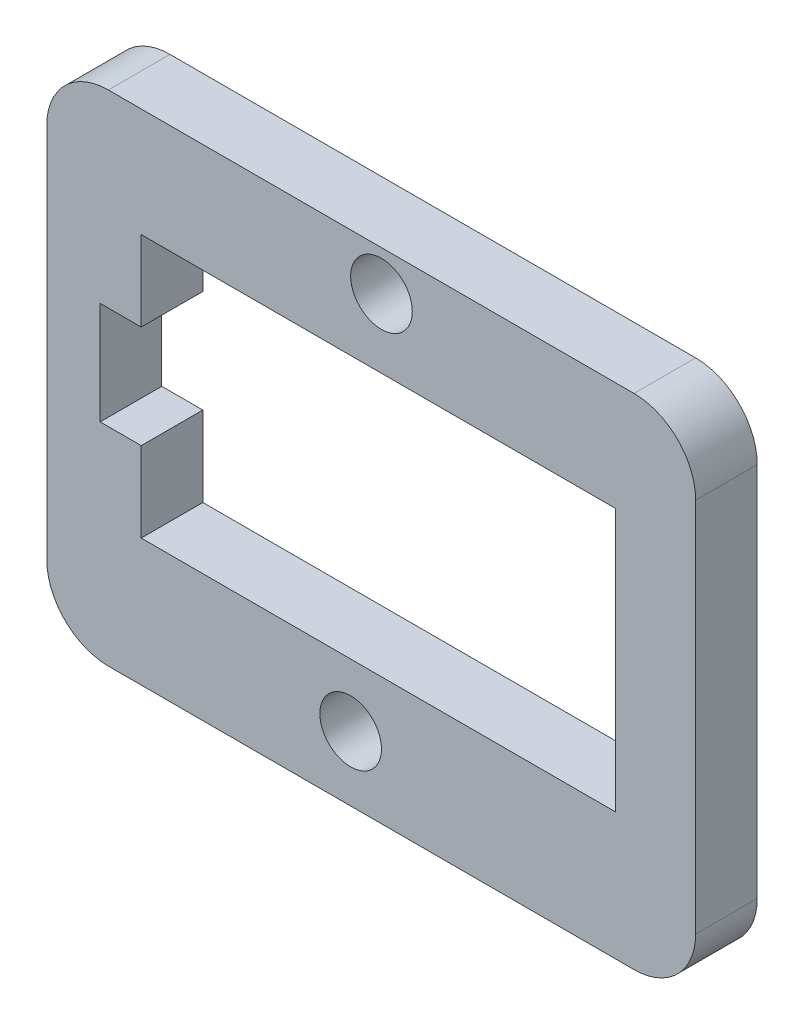
ISO-10303-21;
HEADER;
FILE_DESCRIPTION(('STEP AP214'),'2;1');
FILE_NAME('part.step','',(''),(''),'','','');
FILE_SCHEMA(('AUTOMOTIVE_DESIGN { 1 0 10303 214 1 1 1 1 }'));
ENDSEC;
DATA;
#1=APPLICATION_CONTEXT('core data for automotive mechanical design processes');
#2=APPLICATION_PROTOCOL_DEFINITION('international standard','automotive_design',2000,#1);
#3=PRODUCT_CONTEXT('',#1,'mechanical');
#4=PRODUCT('Part','Part','',(#3));
#5=PRODUCT_RELATED_PRODUCT_CATEGORY('part','',(#4));
#6=PRODUCT_DEFINITION_FORMATION('','',#4);
#7=PRODUCT_DEFINITION_CONTEXT('part definition',#1,'design');
#8=PRODUCT_DEFINITION('design','',#6,#7);
#9=PRODUCT_DEFINITION_SHAPE('','',#8);
#10=(LENGTH_UNIT() NAMED_UNIT(*) SI_UNIT(.MILLI.,.METRE.));
#11=(NAMED_UNIT(*) PLANE_ANGLE_UNIT() SI_UNIT($,.RADIAN.));
#12=(NAMED_UNIT(*) SI_UNIT($,.STERADIAN.) SOLID_ANGLE_UNIT());
#13=UNCERTAINTY_MEASURE_WITH_UNIT(LENGTH_MEASURE(1.E-05),#10,'distance_accuracy_value','');
#14=(GEOMETRIC_REPRESENTATION_CONTEXT(3) GLOBAL_UNCERTAINTY_ASSIGNED_CONTEXT((#13)) GLOBAL_UNIT_ASSIGNED_CONTEXT((#10,
#11,#12)) REPRESENTATION_CONTEXT('',''));
#15=CARTESIAN_POINT('',(0.,0.,0.));
#16=DIRECTION('',(0.,0.,1.));
#17=DIRECTION('',(1.,0.,0.));
#18=AXIS2_PLACEMENT_3D('',#15,#16,#17);
#19=CARTESIAN_POINT('',(25.6000000000002,0.,3.));
#20=DIRECTION('',(0.,0.,1.));
#21=DIRECTION('',(1.,0.,0.));
#22=AXIS2_PLACEMENT_3D('',#19,#20,#21);
#23=PLANE('',#22);
#24=CARTESIAN_POINT('',(11.8,0.150000000000095,3.));
#25=DIRECTION('',(0.,0.,1.));
#26=DIRECTION('',(1.,0.,0.));
#27=AXIS2_PLACEMENT_3D('',#24,#25,#26);
#28=CIRCLE('',#27,1.49999999999995);
#29=CARTESIAN_POINT('',(13.2999999999999,0.150000000000095,3.));
#30=VERTEX_POINT('',#29);
#31=EDGE_CURVE('E185',#30,#30,#28,.T.);
#32=ORIENTED_EDGE('',*,*,#31,.F.);
#33=EDGE_LOOP('',(#32));
#34=FACE_BOUND('',#33,.T.);
#35=CARTESIAN_POINT('',(25.6000000000002,0.,3.));
#36=DIRECTION('',(0.,0.,1.));
#37=DIRECTION('',(1.,0.,0.));
#38=AXIS2_PLACEMENT_3D('',#35,#36,#37);
#39=CIRCLE('',#38,2.99999999999989);
#40=CARTESIAN_POINT('',(25.6,-2.99999999999989,3.));
#41=VERTEX_POINT('',#40);
#42=CARTESIAN_POINT('',(28.6000000000001,8.13585310233123E-13,3.));
#43=VERTEX_POINT('',#42);
#44=EDGE_CURVE('E215',#41,#43,#39,.T.);
#45=ORIENTED_EDGE('',*,*,#44,.T.);
#46=DIRECTION('',(0.,1.,0.));
#47=VECTOR('',#46,1.);
#48=CARTESIAN_POINT('',(28.6000000000001,8.13585310233123E-13,3.));
#49=LINE('',#48,#47);
#50=CARTESIAN_POINT('',(28.6000000000001,18.3000000000006,3.));
#51=VERTEX_POINT('',#50);
#52=EDGE_CURVE('E218',#43,#51,#49,.T.);
#53=ORIENTED_EDGE('',*,*,#52,.T.);
#54=CARTESIAN_POINT('',(25.6000000000002,18.3000000000002,3.));
#55=DIRECTION('',(0.,0.,1.));
#56=DIRECTION('',(1.,0.,0.));
#57=AXIS2_PLACEMENT_3D('',#54,#55,#56);
#58=CIRCLE('',#57,2.99999999999989);
#59=CARTESIAN_POINT('',(25.6,21.3000000000001,3.));
#60=VERTEX_POINT('',#59);
#61=EDGE_CURVE('E221',#51,#60,#58,.T.);
#62=ORIENTED_EDGE('',*,*,#61,.T.);
#63=DIRECTION('',(-1.,0.,0.));
#64=VECTOR('',#63,1.);
#65=CARTESIAN_POINT('',(25.6,21.3000000000001,3.));
#66=LINE('',#65,#64);
#67=CARTESIAN_POINT('',(0.,21.3000000000001,3.));
#68=VERTEX_POINT('',#67);
#69=EDGE_CURVE('E223',#60,#68,#66,.T.);
#70=ORIENTED_EDGE('',*,*,#69,.T.);
#71=CARTESIAN_POINT('',(0.,18.3000000000002,3.));
#72=DIRECTION('',(0.,0.,1.));
#73=DIRECTION('',(1.,0.,0.));
#74=AXIS2_PLACEMENT_3D('',#71,#72,#73);
#75=CIRCLE('',#74,2.99999999999989);
#76=CARTESIAN_POINT('',(-2.99999999999989,18.2999999999959,3.));
#77=VERTEX_POINT('',#76);
#78=EDGE_CURVE('E225',#68,#77,#75,.T.);
#79=ORIENTED_EDGE('',*,*,#78,.T.);
#80=DIRECTION('',(0.,-1.,0.));
#81=VECTOR('',#80,1.);
#82=CARTESIAN_POINT('',(-2.99999999999989,18.2999999999959,3.));
#83=LINE('',#82,#81);
#84=CARTESIAN_POINT('',(-2.99999999999989,-3.87519914032161E-12,3.));
#85=VERTEX_POINT('',#84);
#86=EDGE_CURVE('E227',#77,#85,#83,.T.);
#87=ORIENTED_EDGE('',*,*,#86,.T.);
#88=CARTESIAN_POINT('',(0.,0.,3.));
#89=DIRECTION('',(0.,0.,1.));
#90=DIRECTION('',(1.,0.,0.));
#91=AXIS2_PLACEMENT_3D('',#88,#89,#90);
#92=CIRCLE('',#91,2.99999999999989);
#93=CARTESIAN_POINT('',(0.,-2.99999999999989,3.));
#94=VERTEX_POINT('',#93);
#95=EDGE_CURVE('E229',#85,#94,#92,.T.);
#96=ORIENTED_EDGE('',*,*,#95,.T.);
#97=DIRECTION('',(1.,0.,0.));
#98=VECTOR('',#97,1.);
#99=CARTESIAN_POINT('',(0.,-2.99999999999989,3.));
#100=LINE('',#99,#98);
#101=EDGE_CURVE('E231',#94,#41,#100,.T.);
#102=ORIENTED_EDGE('',*,*,#101,.T.);
#103=EDGE_LOOP('',(#45,#53,#62,#70,#79,#87,#96,#102));
#104=FACE_BOUND('',#103,.T.);
#105=DIRECTION('',(0.,1.,0.));
#106=VECTOR('',#105,1.);
#107=CARTESIAN_POINT('',(24.6999999999972,3.20000000000009,3.));
#108=LINE('',#107,#106);
#109=CARTESIAN_POINT('',(24.6999999999972,3.20000000000009,3.));
#110=VERTEX_POINT('',#109);
#111=CARTESIAN_POINT('',(24.6999999999972,16.,3.));
#112=VERTEX_POINT('',#111);
#113=EDGE_CURVE('E155',#110,#112,#108,.T.);
#114=ORIENTED_EDGE('',*,*,#113,.F.);
#115=DIRECTION('',(1.,0.,0.));
#116=VECTOR('',#115,1.);
#117=CARTESIAN_POINT('',(1.60000000000008,3.20000000000009,3.));
#118=LINE('',#117,#116);
#119=CARTESIAN_POINT('',(1.60000000000008,3.20000000000009,3.));
#120=VERTEX_POINT('',#119);
#121=EDGE_CURVE('E147',#120,#110,#118,.T.);
#122=ORIENTED_EDGE('',*,*,#121,.F.);
#123=DIRECTION('',(0.,-1.,0.));
#124=VECTOR('',#123,1.);
#125=CARTESIAN_POINT('',(1.60000000000008,7.10000000000011,3.));
#126=LINE('',#125,#124);
#127=CARTESIAN_POINT('',(1.60000000000008,7.10000000000011,3.));
#128=VERTEX_POINT('',#127);
#129=EDGE_CURVE('E182',#128,#120,#126,.T.);
#130=ORIENTED_EDGE('',*,*,#129,.F.);
#131=DIRECTION('',(1.,0.,0.));
#132=VECTOR('',#131,1.);
#133=CARTESIAN_POINT('',(-0.399999999999925,7.10000000000011,3.));
#134=LINE('',#133,#132);
#135=CARTESIAN_POINT('',(-0.399999999999925,7.10000000000011,3.));
#136=VERTEX_POINT('',#135);
#137=EDGE_CURVE('E180',#136,#128,#134,.T.);
#138=ORIENTED_EDGE('',*,*,#137,.F.);
#139=DIRECTION('',(0.,-1.,0.));
#140=VECTOR('',#139,1.);
#141=CARTESIAN_POINT('',(-0.399999999999925,12.1,3.));
#142=LINE('',#141,#140);
#143=CARTESIAN_POINT('',(-0.399999999999925,12.1,3.));
#144=VERTEX_POINT('',#143);
#145=EDGE_CURVE('E178',#144,#136,#142,.T.);
#146=ORIENTED_EDGE('',*,*,#145,.F.);
#147=DIRECTION('',(-1.,0.,0.));
#148=VECTOR('',#147,1.);
#149=CARTESIAN_POINT('',(1.5999999999973,12.1,3.));
#150=LINE('',#149,#148);
#151=CARTESIAN_POINT('',(1.5999999999973,12.1,3.));
#152=VERTEX_POINT('',#151);
#153=EDGE_CURVE('E176',#152,#144,#150,.T.);
#154=ORIENTED_EDGE('',*,*,#153,.F.);
#155=DIRECTION('',(0.,-1.,0.));
#156=VECTOR('',#155,1.);
#157=CARTESIAN_POINT('',(1.5999999999973,16.,3.));
#158=LINE('',#157,#156);
#159=CARTESIAN_POINT('',(1.5999999999973,16.,3.));
#160=VERTEX_POINT('',#159);
#161=EDGE_CURVE('E171',#160,#152,#158,.T.);
#162=ORIENTED_EDGE('',*,*,#161,.F.);
#163=DIRECTION('',(-1.,0.,0.));
#164=VECTOR('',#163,1.);
#165=CARTESIAN_POINT('',(24.6999999999972,16.,3.));
#166=LINE('',#165,#164);
#167=EDGE_CURVE('E169',#112,#160,#166,.T.);
#168=ORIENTED_EDGE('',*,*,#167,.F.);
#169=EDGE_LOOP('',(#114,#122,#130,#138,#146,#154,#162,#168));
#170=FACE_BOUND('',#169,.T.);
#171=CARTESIAN_POINT('',(13.300000000001,19.35,3.));
#172=DIRECTION('',(0.,0.,1.));
#173=DIRECTION('',(1.,0.,0.));
#174=AXIS2_PLACEMENT_3D('',#171,#172,#173);
#175=CIRCLE('',#174,1.49999999999995);
#176=CARTESIAN_POINT('',(14.8000000000009,19.35,3.));
#177=VERTEX_POINT('',#176);
#178=EDGE_CURVE('E371',#177,#177,#175,.T.);
#179=ORIENTED_EDGE('',*,*,#178,.F.);
#180=EDGE_LOOP('',(#179));
#181=FACE_BOUND('',#180,.T.);
#182=ADVANCED_FACE('F34',(#34,#104,#170,#181),#23,.T.);
#183=CARTESIAN_POINT('',(25.6000000000002,0.,0.));
#184=DIRECTION('',(0.,0.,1.));
#185=DIRECTION('',(1.,0.,0.));
#186=AXIS2_PLACEMENT_3D('',#183,#184,#185);
#187=PLANE('',#186);
#188=CARTESIAN_POINT('',(25.6000000000002,0.,0.));
#189=DIRECTION('',(0.,0.,1.));
#190=DIRECTION('',(1.,0.,0.));
#191=AXIS2_PLACEMENT_3D('',#188,#189,#190);
#192=CIRCLE('',#191,2.99999999999989);
#193=CARTESIAN_POINT('',(25.6,-2.99999999999989,0.));
#194=VERTEX_POINT('',#193);
#195=CARTESIAN_POINT('',(28.6000000000001,8.13585310233123E-13,0.));
#196=VERTEX_POINT('',#195);
#197=EDGE_CURVE('E163',#194,#196,#192,.T.);
#198=ORIENTED_EDGE('',*,*,#197,.F.);
#199=DIRECTION('',(1.,0.,0.));
#200=VECTOR('',#199,1.);
#201=CARTESIAN_POINT('',(0.,-2.99999999999989,0.));
#202=LINE('',#201,#200);
#203=CARTESIAN_POINT('',(0.,-2.99999999999989,0.));
#204=VERTEX_POINT('',#203);
#205=EDGE_CURVE('E219',#204,#194,#202,.T.);
#206=ORIENTED_EDGE('',*,*,#205,.F.);
#207=CARTESIAN_POINT('',(0.,0.,0.));
#208=DIRECTION('',(0.,0.,1.));
#209=DIRECTION('',(1.,0.,0.));
#210=AXIS2_PLACEMENT_3D('',#207,#208,#209);
#211=CIRCLE('',#210,2.99999999999989);
#212=CARTESIAN_POINT('',(-2.99999999999989,-3.87519914032161E-12,0.));
#213=VERTEX_POINT('',#212);
#214=EDGE_CURVE('E246',#213,#204,#211,.T.);
#215=ORIENTED_EDGE('',*,*,#214,.F.);
#216=DIRECTION('',(0.,-1.,0.));
#217=VECTOR('',#216,1.);
#218=CARTESIAN_POINT('',(-2.99999999999989,18.2999999999959,0.));
#219=LINE('',#218,#217);
#220=CARTESIAN_POINT('',(-2.99999999999989,18.2999999999959,0.));
#221=VERTEX_POINT('',#220);
#222=EDGE_CURVE('E244',#221,#213,#219,.T.);
#223=ORIENTED_EDGE('',*,*,#222,.F.);
#224=CARTESIAN_POINT('',(0.,18.3000000000002,0.));
#225=DIRECTION('',(0.,0.,1.));
#226=DIRECTION('',(1.,0.,0.));
#227=AXIS2_PLACEMENT_3D('',#224,#225,#226);
#228=CIRCLE('',#227,2.99999999999989);
#229=CARTESIAN_POINT('',(0.,21.3000000000001,0.));
#230=VERTEX_POINT('',#229);
#231=EDGE_CURVE('E242',#230,#221,#228,.T.);
#232=ORIENTED_EDGE('',*,*,#231,.F.);
#233=DIRECTION('',(-1.,0.,0.));
#234=VECTOR('',#233,1.);
#235=CARTESIAN_POINT('',(25.6,21.3000000000001,0.));
#236=LINE('',#235,#234);
#237=CARTESIAN_POINT('',(25.6,21.3000000000001,0.));
#238=VERTEX_POINT('',#237);
#239=EDGE_CURVE('E240',#238,#230,#236,.T.);
#240=ORIENTED_EDGE('',*,*,#239,.F.);
#241=CARTESIAN_POINT('',(25.6000000000002,18.3000000000002,0.));
#242=DIRECTION('',(0.,0.,1.));
#243=DIRECTION('',(1.,0.,0.));
#244=AXIS2_PLACEMENT_3D('',#241,#242,#243);
#245=CIRCLE('',#244,2.99999999999989);
#246=CARTESIAN_POINT('',(28.6000000000001,18.3000000000006,0.));
#247=VERTEX_POINT('',#246);
#248=EDGE_CURVE('E238',#247,#238,#245,.T.);
#249=ORIENTED_EDGE('',*,*,#248,.F.);
#250=DIRECTION('',(0.,1.,0.));
#251=VECTOR('',#250,1.);
#252=CARTESIAN_POINT('',(28.6000000000001,8.13585310233123E-13,0.));
#253=LINE('',#252,#251);
#254=EDGE_CURVE('E236',#196,#247,#253,.T.);
#255=ORIENTED_EDGE('',*,*,#254,.F.);
#256=EDGE_LOOP('',(#198,#206,#215,#223,#232,#240,#249,#255));
#257=FACE_BOUND('',#256,.T.);
#258=DIRECTION('',(1.,0.,0.));
#259=VECTOR('',#258,1.);
#260=CARTESIAN_POINT('',(1.60000000000008,3.20000000000009,0.));
#261=LINE('',#260,#259);
#262=CARTESIAN_POINT('',(1.60000000000008,3.20000000000009,0.));
#263=VERTEX_POINT('',#262);
#264=CARTESIAN_POINT('',(24.6999999999972,3.20000000000009,0.));
#265=VERTEX_POINT('',#264);
#266=EDGE_CURVE('E57',#263,#265,#261,.T.);
#267=ORIENTED_EDGE('',*,*,#266,.T.);
#268=DIRECTION('',(0.,1.,0.));
#269=VECTOR('',#268,1.);
#270=CARTESIAN_POINT('',(24.6999999999972,3.20000000000009,0.));
#271=LINE('',#270,#269);
#272=CARTESIAN_POINT('',(24.6999999999972,16.,0.));
#273=VERTEX_POINT('',#272);
#274=EDGE_CURVE('E162',#265,#273,#271,.T.);
#275=ORIENTED_EDGE('',*,*,#274,.T.);
#276=DIRECTION('',(-1.,0.,0.));
#277=VECTOR('',#276,1.);
#278=CARTESIAN_POINT('',(24.6999999999972,16.,0.));
#279=LINE('',#278,#277);
#280=CARTESIAN_POINT('',(1.5999999999973,16.,0.));
#281=VERTEX_POINT('',#280);
#282=EDGE_CURVE('E187',#273,#281,#279,.T.);
#283=ORIENTED_EDGE('',*,*,#282,.T.);
#284=DIRECTION('',(0.,-1.,0.));
#285=VECTOR('',#284,1.);
#286=CARTESIAN_POINT('',(1.5999999999973,16.,0.));
#287=LINE('',#286,#285);
#288=CARTESIAN_POINT('',(1.5999999999973,12.1,0.));
#289=VERTEX_POINT('',#288);
#290=EDGE_CURVE('E190',#281,#289,#287,.T.);
#291=ORIENTED_EDGE('',*,*,#290,.T.);
#292=DIRECTION('',(-1.,0.,0.));
#293=VECTOR('',#292,1.);
#294=CARTESIAN_POINT('',(1.5999999999973,12.1,0.));
#295=LINE('',#294,#293);
#296=CARTESIAN_POINT('',(-0.399999999999925,12.1,0.));
#297=VERTEX_POINT('',#296);
#298=EDGE_CURVE('E193',#289,#297,#295,.T.);
#299=ORIENTED_EDGE('',*,*,#298,.T.);
#300=DIRECTION('',(0.,-1.,0.));
#301=VECTOR('',#300,1.);
#302=CARTESIAN_POINT('',(-0.399999999999925,12.1,0.));
#303=LINE('',#302,#301);
#304=CARTESIAN_POINT('',(-0.399999999999925,7.10000000000011,0.));
#305=VERTEX_POINT('',#304);
#306=EDGE_CURVE('E196',#297,#305,#303,.T.);
#307=ORIENTED_EDGE('',*,*,#306,.T.);
#308=DIRECTION('',(1.,0.,0.));
#309=VECTOR('',#308,1.);
#310=CARTESIAN_POINT('',(-0.399999999999925,7.10000000000011,0.));
#311=LINE('',#310,#309);
#312=CARTESIAN_POINT('',(1.60000000000008,7.10000000000011,0.));
#313=VERTEX_POINT('',#312);
#314=EDGE_CURVE('E199',#305,#313,#311,.T.);
#315=ORIENTED_EDGE('',*,*,#314,.T.);
#316=DIRECTION('',(0.,-1.,0.));
#317=VECTOR('',#316,1.);
#318=CARTESIAN_POINT('',(1.60000000000008,7.10000000000011,0.));
#319=LINE('',#318,#317);
#320=EDGE_CURVE('E156',#313,#263,#319,.T.);
#321=ORIENTED_EDGE('',*,*,#320,.T.);
#322=EDGE_LOOP('',(#267,#275,#283,#291,#299,#307,#315,#321));
#323=FACE_BOUND('',#322,.T.);
#324=CARTESIAN_POINT('',(11.8,0.150000000000095,0.));
#325=DIRECTION('',(0.,0.,1.));
#326=DIRECTION('',(1.,0.,0.));
#327=AXIS2_PLACEMENT_3D('',#324,#325,#326);
#328=CIRCLE('',#327,1.49999999999995);
#329=CARTESIAN_POINT('',(13.2999999999999,0.150000000000095,0.));
#330=VERTEX_POINT('',#329);
#331=EDGE_CURVE('E377',#330,#330,#328,.T.);
#332=ORIENTED_EDGE('',*,*,#331,.T.);
#333=EDGE_LOOP('',(#332));
#334=FACE_BOUND('',#333,.T.);
#335=CARTESIAN_POINT('',(13.300000000001,19.35,0.));
#336=DIRECTION('',(0.,0.,1.));
#337=DIRECTION('',(1.,0.,0.));
#338=AXIS2_PLACEMENT_3D('',#335,#336,#337);
#339=CIRCLE('',#338,1.49999999999995);
#340=CARTESIAN_POINT('',(14.8000000000009,19.35,0.));
#341=VERTEX_POINT('',#340);
#342=EDGE_CURVE('E374',#341,#341,#339,.T.);
#343=ORIENTED_EDGE('',*,*,#342,.T.);
#344=EDGE_LOOP('',(#343));
#345=FACE_BOUND('',#344,.T.);
#346=ADVANCED_FACE('F276',(#257,#323,#334,#345),#187,.F.);
#347=CARTESIAN_POINT('',(25.6000000000002,0.,3.));
#348=DIRECTION('',(0.,0.,-1.));
#349=DIRECTION('',(-1.,0.,0.));
#350=AXIS2_PLACEMENT_3D('',#347,#348,#349);
#351=CYLINDRICAL_SURFACE('',#350,2.99999999999989);
#352=ORIENTED_EDGE('',*,*,#197,.T.);
#353=DIRECTION('',(0.,0.,-1.));
#354=VECTOR('',#353,1.);
#355=CARTESIAN_POINT('',(28.6000000000001,8.13585310233123E-13,3.));
#356=LINE('',#355,#354);
#357=EDGE_CURVE('E11',#43,#196,#356,.T.);
#358=ORIENTED_EDGE('',*,*,#357,.F.);
#359=ORIENTED_EDGE('',*,*,#44,.F.);
#360=DIRECTION('',(0.,0.,-1.));
#361=VECTOR('',#360,1.);
#362=CARTESIAN_POINT('',(25.6,-2.99999999999989,3.));
#363=LINE('',#362,#361);
#364=EDGE_CURVE('E233',#41,#194,#363,.T.);
#365=ORIENTED_EDGE('',*,*,#364,.T.);
#366=EDGE_LOOP('',(#352,#358,#359,#365));
#367=FACE_BOUND('',#366,.T.);
#368=ADVANCED_FACE('F36',(#367),#351,.T.);
#369=CARTESIAN_POINT('',(28.6000000000001,8.13585310233123E-13,3.));
#370=DIRECTION('',(-1.,0.,0.));
#371=DIRECTION('',(0.,-1.,0.));
#372=AXIS2_PLACEMENT_3D('',#369,#370,#371);
#373=PLANE('',#372);
#374=ORIENTED_EDGE('',*,*,#254,.T.);
#375=DIRECTION('',(0.,0.,-1.));
#376=VECTOR('',#375,1.);
#377=CARTESIAN_POINT('',(28.6000000000001,18.3000000000006,3.));
#378=LINE('',#377,#376);
#379=EDGE_CURVE('E42',#51,#247,#378,.T.);
#380=ORIENTED_EDGE('',*,*,#379,.F.);
#381=ORIENTED_EDGE('',*,*,#52,.F.);
#382=ORIENTED_EDGE('',*,*,#357,.T.);
#383=EDGE_LOOP('',(#374,#380,#381,#382));
#384=FACE_BOUND('',#383,.T.);
#385=ADVANCED_FACE('F293',(#384),#373,.F.);
#386=CARTESIAN_POINT('',(25.6000000000002,18.3000000000002,3.));
#387=DIRECTION('',(0.,0.,-1.));
#388=DIRECTION('',(-1.,0.,0.));
#389=AXIS2_PLACEMENT_3D('',#386,#387,#388);
#390=CYLINDRICAL_SURFACE('',#389,2.99999999999989);
#391=ORIENTED_EDGE('',*,*,#248,.T.);
#392=DIRECTION('',(0.,0.,-1.));
#393=VECTOR('',#392,1.);
#394=CARTESIAN_POINT('',(25.6,21.3000000000001,3.));
#395=LINE('',#394,#393);
#396=EDGE_CURVE('E263',#60,#238,#395,.T.);
#397=ORIENTED_EDGE('',*,*,#396,.F.);
#398=ORIENTED_EDGE('',*,*,#61,.F.);
#399=ORIENTED_EDGE('',*,*,#379,.T.);
#400=EDGE_LOOP('',(#391,#397,#398,#399));
#401=FACE_BOUND('',#400,.T.);
#402=ADVANCED_FACE('F270',(#401),#390,.T.);
#403=CARTESIAN_POINT('',(25.6,21.3000000000001,3.));
#404=DIRECTION('',(0.,-1.,0.));
#405=DIRECTION('',(1.,0.,0.));
#406=AXIS2_PLACEMENT_3D('',#403,#404,#405);
#407=PLANE('',#406);
#408=ORIENTED_EDGE('',*,*,#239,.T.);
#409=DIRECTION('',(0.,0.,-1.));
#410=VECTOR('',#409,1.);
#411=CARTESIAN_POINT('',(0.,21.3000000000001,3.));
#412=LINE('',#411,#410);
#413=EDGE_CURVE('E260',#68,#230,#412,.T.);
#414=ORIENTED_EDGE('',*,*,#413,.F.);
#415=ORIENTED_EDGE('',*,*,#69,.F.);
#416=ORIENTED_EDGE('',*,*,#396,.T.);
#417=EDGE_LOOP('',(#408,#414,#415,#416));
#418=FACE_BOUND('',#417,.T.);
#419=ADVANCED_FACE('F282',(#418),#407,.F.);
#420=CARTESIAN_POINT('',(0.,18.3000000000002,3.));
#421=DIRECTION('',(0.,0.,-1.));
#422=DIRECTION('',(-1.,0.,0.));
#423=AXIS2_PLACEMENT_3D('',#420,#421,#422);
#424=CYLINDRICAL_SURFACE('',#423,2.99999999999989);
#425=ORIENTED_EDGE('',*,*,#231,.T.);
#426=DIRECTION('',(0.,0.,-1.));
#427=VECTOR('',#426,1.);
#428=CARTESIAN_POINT('',(-2.99999999999989,18.2999999999959,3.));
#429=LINE('',#428,#427);
#430=EDGE_CURVE('E257',#77,#221,#429,.T.);
#431=ORIENTED_EDGE('',*,*,#430,.F.);
#432=ORIENTED_EDGE('',*,*,#78,.F.);
#433=ORIENTED_EDGE('',*,*,#413,.T.);
#434=EDGE_LOOP('',(#425,#431,#432,#433));
#435=FACE_BOUND('',#434,.T.);
#436=ADVANCED_FACE('F286',(#435),#424,.T.);
#437=CARTESIAN_POINT('',(-2.99999999999989,18.2999999999959,3.));
#438=DIRECTION('',(1.,0.,0.));
#439=DIRECTION('',(0.,0.,-1.));
#440=AXIS2_PLACEMENT_3D('',#437,#438,#439);
#441=PLANE('',#440);
#442=ORIENTED_EDGE('',*,*,#222,.T.);
#443=DIRECTION('',(0.,0.,-1.));
#444=VECTOR('',#443,1.);
#445=CARTESIAN_POINT('',(-2.99999999999989,-3.87519914032161E-12,3.));
#446=LINE('',#445,#444);
#447=EDGE_CURVE('E254',#85,#213,#446,.T.);
#448=ORIENTED_EDGE('',*,*,#447,.F.);
#449=ORIENTED_EDGE('',*,*,#86,.F.);
#450=ORIENTED_EDGE('',*,*,#430,.T.);
#451=EDGE_LOOP('',(#442,#448,#449,#450));
#452=FACE_BOUND('',#451,.T.);
#453=ADVANCED_FACE('F306',(#452),#441,.F.);
#454=CARTESIAN_POINT('',(0.,0.,3.));
#455=DIRECTION('',(0.,0.,-1.));
#456=DIRECTION('',(-1.,0.,0.));
#457=AXIS2_PLACEMENT_3D('',#454,#455,#456);
#458=CYLINDRICAL_SURFACE('',#457,2.99999999999989);
#459=ORIENTED_EDGE('',*,*,#214,.T.);
#460=DIRECTION('',(0.,0.,-1.));
#461=VECTOR('',#460,1.);
#462=CARTESIAN_POINT('',(0.,-2.99999999999989,3.));
#463=LINE('',#462,#461);
#464=EDGE_CURVE('E251',#94,#204,#463,.T.);
#465=ORIENTED_EDGE('',*,*,#464,.F.);
#466=ORIENTED_EDGE('',*,*,#95,.F.);
#467=ORIENTED_EDGE('',*,*,#447,.T.);
#468=EDGE_LOOP('',(#459,#465,#466,#467));
#469=FACE_BOUND('',#468,.T.);
#470=ADVANCED_FACE('F304',(#469),#458,.T.);
#471=CARTESIAN_POINT('',(0.,-2.99999999999989,3.));
#472=DIRECTION('',(0.,1.,0.));
#473=DIRECTION('',(0.,0.,1.));
#474=AXIS2_PLACEMENT_3D('',#471,#472,#473);
#475=PLANE('',#474);
#476=ORIENTED_EDGE('',*,*,#205,.T.);
#477=ORIENTED_EDGE('',*,*,#364,.F.);
#478=ORIENTED_EDGE('',*,*,#101,.F.);
#479=ORIENTED_EDGE('',*,*,#464,.T.);
#480=EDGE_LOOP('',(#476,#477,#478,#479));
#481=FACE_BOUND('',#480,.T.);
#482=ADVANCED_FACE('F299',(#481),#475,.F.);
#483=CARTESIAN_POINT('',(1.60000000000008,3.20000000000009,3.));
#484=DIRECTION('',(0.,1.,0.));
#485=DIRECTION('',(0.,0.,1.));
#486=AXIS2_PLACEMENT_3D('',#483,#484,#485);
#487=PLANE('',#486);
#488=ORIENTED_EDGE('',*,*,#266,.F.);
#489=DIRECTION('',(0.,0.,-1.));
#490=VECTOR('',#489,1.);
#491=CARTESIAN_POINT('',(1.60000000000008,3.20000000000009,3.));
#492=LINE('',#491,#490);
#493=EDGE_CURVE('E151',#120,#263,#492,.T.);
#494=ORIENTED_EDGE('',*,*,#493,.F.);
#495=ORIENTED_EDGE('',*,*,#121,.T.);
#496=DIRECTION('',(0.,0.,-1.));
#497=VECTOR('',#496,1.);
#498=CARTESIAN_POINT('',(24.6999999999972,3.20000000000009,3.));
#499=LINE('',#498,#497);
#500=EDGE_CURVE('E150',#110,#265,#499,.T.);
#501=ORIENTED_EDGE('',*,*,#500,.T.);
#502=EDGE_LOOP('',(#488,#494,#495,#501));
#503=FACE_BOUND('',#502,.T.);
#504=ADVANCED_FACE('F149',(#503),#487,.T.);
#505=CARTESIAN_POINT('',(24.6999999999972,3.20000000000009,3.));
#506=DIRECTION('',(-1.,0.,0.));
#507=DIRECTION('',(0.,0.,1.));
#508=AXIS2_PLACEMENT_3D('',#505,#506,#507);
#509=PLANE('',#508);
#510=ORIENTED_EDGE('',*,*,#274,.F.);
#511=ORIENTED_EDGE('',*,*,#500,.F.);
#512=ORIENTED_EDGE('',*,*,#113,.T.);
#513=DIRECTION('',(0.,0.,-1.));
#514=VECTOR('',#513,1.);
#515=CARTESIAN_POINT('',(24.6999999999972,16.,3.));
#516=LINE('',#515,#514);
#517=EDGE_CURVE('E164',#112,#273,#516,.T.);
#518=ORIENTED_EDGE('',*,*,#517,.T.);
#519=EDGE_LOOP('',(#510,#511,#512,#518));
#520=FACE_BOUND('',#519,.T.);
#521=ADVANCED_FACE('F159',(#520),#509,.T.);
#522=CARTESIAN_POINT('',(24.6999999999972,16.,3.));
#523=DIRECTION('',(0.,-1.,0.));
#524=DIRECTION('',(0.,0.,-1.));
#525=AXIS2_PLACEMENT_3D('',#522,#523,#524);
#526=PLANE('',#525);
#527=ORIENTED_EDGE('',*,*,#282,.F.);
#528=ORIENTED_EDGE('',*,*,#517,.F.);
#529=ORIENTED_EDGE('',*,*,#167,.T.);
#530=DIRECTION('',(0.,0.,-1.));
#531=VECTOR('',#530,1.);
#532=CARTESIAN_POINT('',(1.5999999999973,16.,3.));
#533=LINE('',#532,#531);
#534=EDGE_CURVE('E212',#160,#281,#533,.T.);
#535=ORIENTED_EDGE('',*,*,#534,.T.);
#536=EDGE_LOOP('',(#527,#528,#529,#535));
#537=FACE_BOUND('',#536,.T.);
#538=ADVANCED_FACE('F333',(#537),#526,.T.);
#539=CARTESIAN_POINT('',(1.5999999999973,16.,3.));
#540=DIRECTION('',(1.,0.,0.));
#541=DIRECTION('',(0.,0.,-1.));
#542=AXIS2_PLACEMENT_3D('',#539,#540,#541);
#543=PLANE('',#542);
#544=ORIENTED_EDGE('',*,*,#290,.F.);
#545=ORIENTED_EDGE('',*,*,#534,.F.);
#546=ORIENTED_EDGE('',*,*,#161,.T.);
#547=DIRECTION('',(0.,0.,-1.));
#548=VECTOR('',#547,1.);
#549=CARTESIAN_POINT('',(1.5999999999973,12.1,3.));
#550=LINE('',#549,#548);
#551=EDGE_CURVE('E210',#152,#289,#550,.T.);
#552=ORIENTED_EDGE('',*,*,#551,.T.);
#553=EDGE_LOOP('',(#544,#545,#546,#552));
#554=FACE_BOUND('',#553,.T.);
#555=ADVANCED_FACE('F337',(#554),#543,.T.);
#556=CARTESIAN_POINT('',(1.5999999999973,12.1,3.));
#557=DIRECTION('',(0.,-1.,0.));
#558=DIRECTION('',(0.,0.,-1.));
#559=AXIS2_PLACEMENT_3D('',#556,#557,#558);
#560=PLANE('',#559);
#561=ORIENTED_EDGE('',*,*,#298,.F.);
#562=ORIENTED_EDGE('',*,*,#551,.F.);
#563=ORIENTED_EDGE('',*,*,#153,.T.);
#564=DIRECTION('',(0.,0.,-1.));
#565=VECTOR('',#564,1.);
#566=CARTESIAN_POINT('',(-0.399999999999925,12.1,3.));
#567=LINE('',#566,#565);
#568=EDGE_CURVE('E208',#144,#297,#567,.T.);
#569=ORIENTED_EDGE('',*,*,#568,.T.);
#570=EDGE_LOOP('',(#561,#562,#563,#569));
#571=FACE_BOUND('',#570,.T.);
#572=ADVANCED_FACE('F343',(#571),#560,.T.);
#573=CARTESIAN_POINT('',(-0.399999999999925,12.1,3.));
#574=DIRECTION('',(1.,0.,0.));
#575=DIRECTION('',(0.,0.,-1.));
#576=AXIS2_PLACEMENT_3D('',#573,#574,#575);
#577=PLANE('',#576);
#578=ORIENTED_EDGE('',*,*,#306,.F.);
#579=ORIENTED_EDGE('',*,*,#568,.F.);
#580=ORIENTED_EDGE('',*,*,#145,.T.);
#581=DIRECTION('',(0.,0.,-1.));
#582=VECTOR('',#581,1.);
#583=CARTESIAN_POINT('',(-0.399999999999925,7.10000000000011,3.));
#584=LINE('',#583,#582);
#585=EDGE_CURVE('E206',#136,#305,#584,.T.);
#586=ORIENTED_EDGE('',*,*,#585,.T.);
#587=EDGE_LOOP('',(#578,#579,#580,#586));
#588=FACE_BOUND('',#587,.T.);
#589=ADVANCED_FACE('F347',(#588),#577,.T.);
#590=CARTESIAN_POINT('',(-0.399999999999925,7.10000000000011,3.));
#591=DIRECTION('',(0.,1.,0.));
#592=DIRECTION('',(0.,0.,1.));
#593=AXIS2_PLACEMENT_3D('',#590,#591,#592);
#594=PLANE('',#593);
#595=ORIENTED_EDGE('',*,*,#314,.F.);
#596=ORIENTED_EDGE('',*,*,#585,.F.);
#597=ORIENTED_EDGE('',*,*,#137,.T.);
#598=DIRECTION('',(0.,0.,-1.));
#599=VECTOR('',#598,1.);
#600=CARTESIAN_POINT('',(1.60000000000008,7.10000000000011,3.));
#601=LINE('',#600,#599);
#602=EDGE_CURVE('E49',#128,#313,#601,.T.);
#603=ORIENTED_EDGE('',*,*,#602,.T.);
#604=EDGE_LOOP('',(#595,#596,#597,#603));
#605=FACE_BOUND('',#604,.T.);
#606=ADVANCED_FACE('F351',(#605),#594,.T.);
#607=CARTESIAN_POINT('',(1.60000000000008,7.10000000000011,3.));
#608=DIRECTION('',(1.,0.,0.));
#609=DIRECTION('',(0.,0.,-1.));
#610=AXIS2_PLACEMENT_3D('',#607,#608,#609);
#611=PLANE('',#610);
#612=ORIENTED_EDGE('',*,*,#320,.F.);
#613=ORIENTED_EDGE('',*,*,#602,.F.);
#614=ORIENTED_EDGE('',*,*,#129,.T.);
#615=ORIENTED_EDGE('',*,*,#493,.T.);
#616=EDGE_LOOP('',(#612,#613,#614,#615));
#617=FACE_BOUND('',#616,.T.);
#618=ADVANCED_FACE('F355',(#617),#611,.T.);
#619=CARTESIAN_POINT('',(11.8,0.150000000000095,3.));
#620=DIRECTION('',(0.,0.,-1.));
#621=DIRECTION('',(-1.,0.,0.));
#622=AXIS2_PLACEMENT_3D('',#619,#620,#621);
#623=CYLINDRICAL_SURFACE('',#622,1.49999999999995);
#624=ORIENTED_EDGE('',*,*,#31,.T.);
#625=EDGE_LOOP('',(#624));
#626=FACE_BOUND('',#625,.T.);
#627=ORIENTED_EDGE('',*,*,#331,.F.);
#628=EDGE_LOOP('',(#627));
#629=FACE_BOUND('',#628,.T.);
#630=ADVANCED_FACE('F359',(#626,#629),#623,.F.);
#631=CARTESIAN_POINT('',(13.300000000001,19.35,3.));
#632=DIRECTION('',(0.,0.,-1.));
#633=DIRECTION('',(-1.,0.,0.));
#634=AXIS2_PLACEMENT_3D('',#631,#632,#633);
#635=CYLINDRICAL_SURFACE('',#634,1.49999999999995);
#636=ORIENTED_EDGE('',*,*,#178,.T.);
#637=EDGE_LOOP('',(#636));
#638=FACE_BOUND('',#637,.T.);
#639=ORIENTED_EDGE('',*,*,#342,.F.);
#640=EDGE_LOOP('',(#639));
#641=FACE_BOUND('',#640,.T.);
#642=ADVANCED_FACE('F362',(#638,#641),#635,.F.);
#643=CLOSED_SHELL('',(#182,#346,#368,#385,#402,#419,#436,#453,#470,#482,#504,#521,#538,#555,
#572,#589,#606,#618,#630,#642));
#644=MANIFOLD_SOLID_BREP('B2',#643);
#645=ADVANCED_BREP_SHAPE_REPRESENTATION('',(#18,#644),#14);
#646=SHAPE_DEFINITION_REPRESENTATION(#9,#645);
ENDSEC;
END-ISO-10303-21;
